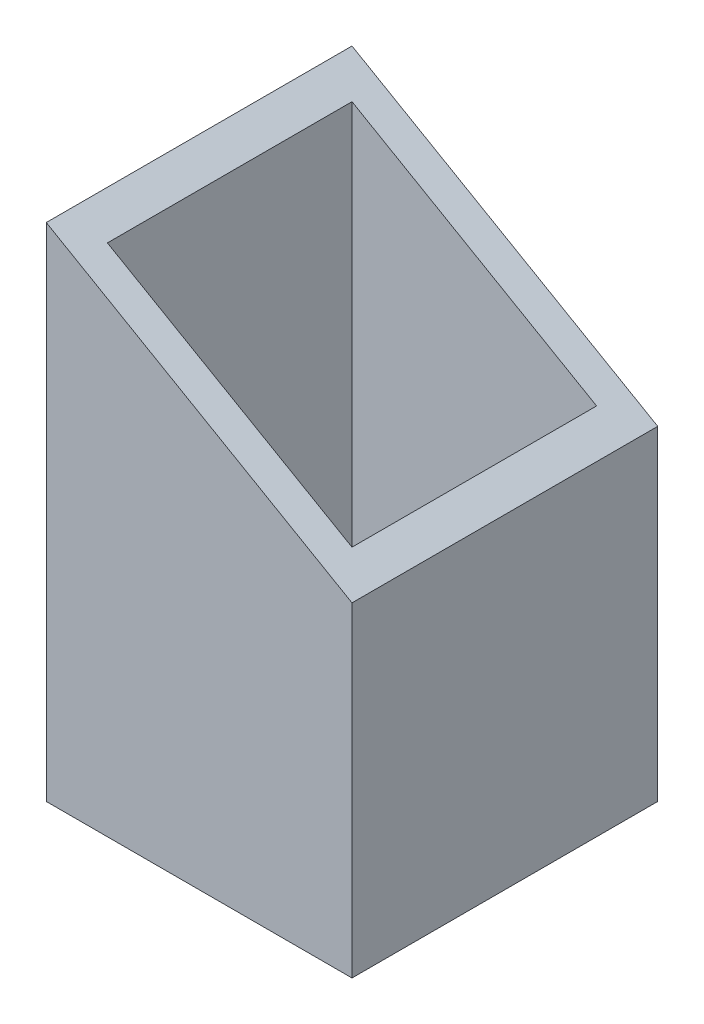
ISO-10303-21;
HEADER;
FILE_DESCRIPTION(('STEP AP214'),'2;1');
FILE_NAME('part.step','',(''),(''),'','','');
FILE_SCHEMA(('AUTOMOTIVE_DESIGN { 1 0 10303 214 1 1 1 1 }'));
ENDSEC;
DATA;
#1=APPLICATION_CONTEXT('core data for automotive mechanical design processes');
#2=APPLICATION_PROTOCOL_DEFINITION('international standard','automotive_design',2000,#1);
#3=PRODUCT_CONTEXT('',#1,'mechanical');
#4=PRODUCT('Part','Part','',(#3));
#5=PRODUCT_RELATED_PRODUCT_CATEGORY('part','',(#4));
#6=PRODUCT_DEFINITION_FORMATION('','',#4);
#7=PRODUCT_DEFINITION_CONTEXT('part definition',#1,'design');
#8=PRODUCT_DEFINITION('design','',#6,#7);
#9=PRODUCT_DEFINITION_SHAPE('','',#8);
#10=(LENGTH_UNIT() NAMED_UNIT(*) SI_UNIT(.MILLI.,.METRE.));
#11=(NAMED_UNIT(*) PLANE_ANGLE_UNIT() SI_UNIT($,.RADIAN.));
#12=(NAMED_UNIT(*) SI_UNIT($,.STERADIAN.) SOLID_ANGLE_UNIT());
#13=UNCERTAINTY_MEASURE_WITH_UNIT(LENGTH_MEASURE(1.E-05),#10,'distance_accuracy_value','');
#14=(GEOMETRIC_REPRESENTATION_CONTEXT(3) GLOBAL_UNCERTAINTY_ASSIGNED_CONTEXT((#13)) GLOBAL_UNIT_ASSIGNED_CONTEXT((#10,
#11,#12)) REPRESENTATION_CONTEXT('',''));
#15=CARTESIAN_POINT('',(0.,0.,0.));
#16=DIRECTION('',(0.,0.,1.));
#17=DIRECTION('',(1.,0.,0.));
#18=AXIS2_PLACEMENT_3D('',#15,#16,#17);
#19=CARTESIAN_POINT('',(-223.415724970984,500000.000000032,1808.3229528099));
#20=DIRECTION('',(1.,0.,0.));
#21=DIRECTION('',(0.,0.,-1.));
#22=AXIS2_PLACEMENT_3D('',#19,#20,#21);
#23=PLANE('',#22);
#24=DIRECTION('',(0.,1.,0.));
#25=VECTOR('',#24,1.);
#26=CARTESIAN_POINT('',(-223.415724971009,500000.000000032,1828.8));
#27=LINE('',#26,#25);
#28=CARTESIAN_POINT('',(-223.415724971003,95.250000000016,1828.8));
#29=VERTEX_POINT('',#28);
#30=CARTESIAN_POINT('',(-223.415724971045,128.989128953536,1828.8));
#31=VERTEX_POINT('',#30);
#32=EDGE_CURVE('E146',#29,#31,#27,.T.);
#33=ORIENTED_EDGE('',*,*,#32,.F.);
#34=DIRECTION('',(0.,0.,1.));
#35=VECTOR('',#34,1.);
#36=CARTESIAN_POINT('',(-223.415724971009,95.25,-500000.000000032));
#37=LINE('',#36,#35);
#38=CARTESIAN_POINT('',(-223.415724971003,95.250000000016,1797.05));
#39=VERTEX_POINT('',#38);
#40=EDGE_CURVE('E137',#29,#39,#37,.F.);
#41=ORIENTED_EDGE('',*,*,#40,.T.);
#42=DIRECTION('',(0.,1.,0.));
#43=VECTOR('',#42,1.);
#44=CARTESIAN_POINT('',(-223.415724971009,500000.000000032,1797.05));
#45=LINE('',#44,#43);
#46=CARTESIAN_POINT('',(-223.415724971048,128.989128953559,1797.05));
#47=VERTEX_POINT('',#46);
#48=EDGE_CURVE('E110',#39,#47,#45,.T.);
#49=ORIENTED_EDGE('',*,*,#48,.T.);
#50=DIRECTION('',(0.,0.,1.));
#51=VECTOR('',#50,1.);
#52=CARTESIAN_POINT('',(-223.415724971231,128.989128953334,1828.8));
#53=LINE('',#52,#51);
#54=EDGE_CURVE('E107',#31,#47,#53,.F.);
#55=ORIENTED_EDGE('',*,*,#54,.F.);
#56=EDGE_LOOP('',(#33,#41,#49,#55));
#57=FACE_BOUND('',#56,.T.);
#58=ADVANCED_FACE('F17',(#57),#23,.T.);
#59=CARTESIAN_POINT('',(-241.414785422981,500000.000000032,1800.225));
#60=DIRECTION('',(0.,0.,1.));
#61=DIRECTION('',(1.,0.,0.));
#62=AXIS2_PLACEMENT_3D('',#59,#60,#61);
#63=PLANE('',#62);
#64=DIRECTION('',(0.,1.,0.));
#65=VECTOR('',#64,1.);
#66=CARTESIAN_POINT('',(-251.990724970984,500000.000000032,1800.225));
#67=LINE('',#66,#65);
#68=CARTESIAN_POINT('',(-251.990724971041,95.250000000016,1800.225));
#69=VERTEX_POINT('',#68);
#70=CARTESIAN_POINT('',(-251.990724971096,145.486912895636,1800.225));
#71=VERTEX_POINT('',#70);
#72=EDGE_CURVE('E115',#69,#71,#67,.T.);
#73=ORIENTED_EDGE('',*,*,#72,.F.);
#74=DIRECTION('',(1.,0.,0.));
#75=VECTOR('',#74,1.);
#76=CARTESIAN_POINT('',(-226.369179823143,95.25,1800.22500000001));
#77=LINE('',#76,#75);
#78=CARTESIAN_POINT('',(-226.590724971003,95.250000000016,1800.225));
#79=VERTEX_POINT('',#78);
#80=EDGE_CURVE('E94',#69,#79,#77,.T.);
#81=ORIENTED_EDGE('',*,*,#80,.T.);
#82=DIRECTION('',(0.,1.,0.));
#83=VECTOR('',#82,1.);
#84=CARTESIAN_POINT('',(-226.590724970984,500000.000000032,1800.225));
#85=LINE('',#84,#83);
#86=CARTESIAN_POINT('',(-226.590724971048,130.822216058151,1800.225));
#87=VERTEX_POINT('',#86);
#88=EDGE_CURVE('E20',#79,#87,#85,.T.);
#89=ORIENTED_EDGE('',*,*,#88,.T.);
#90=DIRECTION('',(-0.866025403784429,0.500000000000017,0.));
#91=VECTOR('',#90,1.);
#92=CARTESIAN_POINT('',(-127.58286248553,73.66,1800.225));
#93=LINE('',#92,#91);
#94=EDGE_CURVE('E79',#71,#87,#93,.F.);
#95=ORIENTED_EDGE('',*,*,#94,.F.);
#96=EDGE_LOOP('',(#73,#81,#89,#95));
#97=FACE_BOUND('',#96,.T.);
#98=ADVANCED_FACE('F93',(#97),#63,.T.);
#99=CARTESIAN_POINT('',(-226.590724970984,500000.000000032,1808.3229528099));
#100=DIRECTION('',(1.,0.,0.));
#101=DIRECTION('',(0.,0.,-1.));
#102=AXIS2_PLACEMENT_3D('',#99,#100,#101);
#103=PLANE('',#102);
#104=DIRECTION('',(0.,1.,0.));
#105=VECTOR('',#104,1.);
#106=CARTESIAN_POINT('',(-226.590724971009,500000.000000032,1825.625));
#107=LINE('',#106,#105);
#108=CARTESIAN_POINT('',(-226.590724970996,95.250000000016,1825.625));
#109=VERTEX_POINT('',#108);
#110=CARTESIAN_POINT('',(-226.590724971049,130.822216058182,1825.625));
#111=VERTEX_POINT('',#110);
#112=EDGE_CURVE('E98',#109,#111,#107,.T.);
#113=ORIENTED_EDGE('',*,*,#112,.T.);
#114=DIRECTION('',(0.,0.,1.));
#115=VECTOR('',#114,1.);
#116=CARTESIAN_POINT('',(-226.590724971245,130.82221605802,1828.8));
#117=LINE('',#116,#115);
#118=EDGE_CURVE('E84',#87,#111,#117,.T.);
#119=ORIENTED_EDGE('',*,*,#118,.F.);
#120=ORIENTED_EDGE('',*,*,#88,.F.);
#121=DIRECTION('',(0.,0.,1.));
#122=VECTOR('',#121,1.);
#123=CARTESIAN_POINT('',(-226.590724971009,95.25,-500000.000000032));
#124=LINE('',#123,#122);
#125=EDGE_CURVE('E131',#79,#109,#124,.T.);
#126=ORIENTED_EDGE('',*,*,#125,.T.);
#127=EDGE_LOOP('',(#113,#119,#120,#126));
#128=FACE_BOUND('',#127,.T.);
#129=ADVANCED_FACE('F99',(#128),#103,.F.);
#130=CARTESIAN_POINT('',(-237.348847091146,500000.000000032,1825.625));
#131=DIRECTION('',(0.,0.,1.));
#132=DIRECTION('',(1.,0.,0.));
#133=AXIS2_PLACEMENT_3D('',#130,#131,#132);
#134=PLANE('',#133);
#135=DIRECTION('',(0.,1.,0.));
#136=VECTOR('',#135,1.);
#137=CARTESIAN_POINT('',(-251.990724970984,500000.000000032,1825.625));
#138=LINE('',#137,#136);
#139=CARTESIAN_POINT('',(-251.990724971096,145.486912895636,1825.625));
#140=VERTEX_POINT('',#139);
#141=CARTESIAN_POINT('',(-251.990724971041,95.250000000016,1825.625));
#142=VERTEX_POINT('',#141);
#143=EDGE_CURVE('E113',#140,#142,#138,.F.);
#144=ORIENTED_EDGE('',*,*,#143,.F.);
#145=DIRECTION('',(-0.866025403784429,0.500000000000017,0.));
#146=VECTOR('',#145,1.);
#147=CARTESIAN_POINT('',(-127.58286248553,73.66,1825.625));
#148=LINE('',#147,#146);
#149=EDGE_CURVE('E101',#111,#140,#148,.T.);
#150=ORIENTED_EDGE('',*,*,#149,.F.);
#151=ORIENTED_EDGE('',*,*,#112,.F.);
#152=DIRECTION('',(1.,0.,0.));
#153=VECTOR('',#152,1.);
#154=CARTESIAN_POINT('',(-226.369179823143,95.25,1825.625));
#155=LINE('',#154,#153);
#156=EDGE_CURVE('E126',#109,#142,#155,.F.);
#157=ORIENTED_EDGE('',*,*,#156,.T.);
#158=EDGE_LOOP('',(#144,#150,#151,#157));
#159=FACE_BOUND('',#158,.T.);
#160=ADVANCED_FACE('F172',(#159),#134,.F.);
#161=CARTESIAN_POINT('',(-251.990724970984,500000.000000032,1808.3229528099));
#162=DIRECTION('',(1.,0.,0.));
#163=DIRECTION('',(0.,0.,-1.));
#164=AXIS2_PLACEMENT_3D('',#161,#162,#163);
#165=PLANE('',#164);
#166=ORIENTED_EDGE('',*,*,#143,.T.);
#167=DIRECTION('',(0.,0.,1.));
#168=VECTOR('',#167,1.);
#169=CARTESIAN_POINT('',(-251.990724971009,95.25,-500000.000000032));
#170=LINE('',#169,#168);
#171=EDGE_CURVE('E120',#142,#69,#170,.F.);
#172=ORIENTED_EDGE('',*,*,#171,.T.);
#173=ORIENTED_EDGE('',*,*,#72,.T.);
#174=DIRECTION('',(0.,0.,1.));
#175=VECTOR('',#174,1.);
#176=CARTESIAN_POINT('',(-251.990724971238,145.486912895433,1828.8));
#177=LINE('',#176,#175);
#178=EDGE_CURVE('E87',#140,#71,#177,.F.);
#179=ORIENTED_EDGE('',*,*,#178,.F.);
#180=EDGE_LOOP('',(#166,#172,#173,#179));
#181=FACE_BOUND('',#180,.T.);
#182=ADVANCED_FACE('F118',(#181),#165,.T.);
#183=CARTESIAN_POINT('',(-241.414785422981,500000.000000032,1797.05));
#184=DIRECTION('',(0.,0.,1.));
#185=DIRECTION('',(1.,0.,0.));
#186=AXIS2_PLACEMENT_3D('',#183,#184,#185);
#187=PLANE('',#186);
#188=DIRECTION('',(-0.866025403784429,0.500000000000017,0.));
#189=VECTOR('',#188,1.);
#190=CARTESIAN_POINT('',(-127.58286248553,73.66,1797.05));
#191=LINE('',#190,#189);
#192=CARTESIAN_POINT('',(-255.1657249711,147.320000000308,1797.05));
#193=VERTEX_POINT('',#192);
#194=EDGE_CURVE('E90',#47,#193,#191,.T.);
#195=ORIENTED_EDGE('',*,*,#194,.F.);
#196=ORIENTED_EDGE('',*,*,#48,.F.);
#197=DIRECTION('',(1.,0.,0.));
#198=VECTOR('',#197,1.);
#199=CARTESIAN_POINT('',(-226.369179823143,95.25,1797.05000000001));
#200=LINE('',#199,#198);
#201=CARTESIAN_POINT('',(-255.16572497106,95.250000000016,1797.05));
#202=VERTEX_POINT('',#201);
#203=EDGE_CURVE('E141',#39,#202,#200,.F.);
#204=ORIENTED_EDGE('',*,*,#203,.T.);
#205=DIRECTION('',(0.,1.,0.));
#206=VECTOR('',#205,1.);
#207=CARTESIAN_POINT('',(-255.16572497106,500000.000000032,1797.05));
#208=LINE('',#207,#206);
#209=EDGE_CURVE('E125',#202,#193,#208,.T.);
#210=ORIENTED_EDGE('',*,*,#209,.T.);
#211=EDGE_LOOP('',(#195,#196,#204,#210));
#212=FACE_BOUND('',#211,.T.);
#213=ADVANCED_FACE('F163',(#212),#187,.F.);
#214=CARTESIAN_POINT('',(-127.58286248553,73.66,1828.8));
#215=DIRECTION('',(0.500000000000017,0.866025403784429,0.));
#216=DIRECTION('',(-0.866025403784429,0.500000000000017,0.));
#217=AXIS2_PLACEMENT_3D('',#214,#215,#216);
#218=PLANE('',#217);
#219=ORIENTED_EDGE('',*,*,#149,.T.);
#220=ORIENTED_EDGE('',*,*,#178,.T.);
#221=ORIENTED_EDGE('',*,*,#94,.T.);
#222=ORIENTED_EDGE('',*,*,#118,.T.);
#223=EDGE_LOOP('',(#219,#220,#221,#222));
#224=FACE_BOUND('',#223,.T.);
#225=DIRECTION('',(0.,0.,-1.));
#226=VECTOR('',#225,1.);
#227=CARTESIAN_POINT('',(-255.16572497106,147.320000000377,1808.3229528099));
#228=LINE('',#227,#226);
#229=CARTESIAN_POINT('',(-255.165724971137,147.320000000222,1828.8));
#230=VERTEX_POINT('',#229);
#231=EDGE_CURVE('E129',#193,#230,#228,.F.);
#232=ORIENTED_EDGE('',*,*,#231,.T.);
#233=DIRECTION('',(-0.866025403784928,0.499999999999152,0.));
#234=VECTOR('',#233,1.);
#235=CARTESIAN_POINT('',(-223.415724971085,128.989128953606,1828.8));
#236=LINE('',#235,#234);
#237=EDGE_CURVE('E144',#31,#230,#236,.T.);
#238=ORIENTED_EDGE('',*,*,#237,.F.);
#239=ORIENTED_EDGE('',*,*,#54,.T.);
#240=ORIENTED_EDGE('',*,*,#194,.T.);
#241=EDGE_LOOP('',(#232,#238,#239,#240));
#242=FACE_BOUND('',#241,.T.);
#243=ADVANCED_FACE('F81',(#224,#242),#218,.T.);
#244=CARTESIAN_POINT('',(-237.348847091146,500000.000000032,1828.8));
#245=DIRECTION('',(0.,0.,1.));
#246=DIRECTION('',(1.,0.,0.));
#247=AXIS2_PLACEMENT_3D('',#244,#245,#246);
#248=PLANE('',#247);
#249=DIRECTION('',(0.,1.,0.));
#250=VECTOR('',#249,1.);
#251=CARTESIAN_POINT('',(-255.16572497106,500000.000000032,1828.8));
#252=LINE('',#251,#250);
#253=CARTESIAN_POINT('',(-255.16572497106,95.250000000016,1828.8));
#254=VERTEX_POINT('',#253);
#255=EDGE_CURVE('E26',#230,#254,#252,.F.);
#256=ORIENTED_EDGE('',*,*,#255,.T.);
#257=DIRECTION('',(1.,0.,0.));
#258=VECTOR('',#257,1.);
#259=CARTESIAN_POINT('',(-226.369179823143,95.25,1828.8));
#260=LINE('',#259,#258);
#261=EDGE_CURVE('E34',#254,#29,#260,.T.);
#262=ORIENTED_EDGE('',*,*,#261,.T.);
#263=ORIENTED_EDGE('',*,*,#32,.T.);
#264=ORIENTED_EDGE('',*,*,#237,.T.);
#265=EDGE_LOOP('',(#256,#262,#263,#264));
#266=FACE_BOUND('',#265,.T.);
#267=ADVANCED_FACE('F150',(#266),#248,.T.);
#268=CARTESIAN_POINT('',(-226.369179823143,95.25,-500000.000000032));
#269=DIRECTION('',(0.,1.,0.));
#270=DIRECTION('',(0.,0.,1.));
#271=AXIS2_PLACEMENT_3D('',#268,#269,#270);
#272=PLANE('',#271);
#273=ORIENTED_EDGE('',*,*,#156,.F.);
#274=ORIENTED_EDGE('',*,*,#125,.F.);
#275=ORIENTED_EDGE('',*,*,#80,.F.);
#276=ORIENTED_EDGE('',*,*,#171,.F.);
#277=EDGE_LOOP('',(#273,#274,#275,#276));
#278=FACE_BOUND('',#277,.T.);
#279=ORIENTED_EDGE('',*,*,#261,.F.);
#280=DIRECTION('',(0.,0.,-1.));
#281=VECTOR('',#280,1.);
#282=CARTESIAN_POINT('',(-255.16572497106,95.2500000000214,1808.3229528099));
#283=LINE('',#282,#281);
#284=EDGE_CURVE('E11',#254,#202,#283,.T.);
#285=ORIENTED_EDGE('',*,*,#284,.T.);
#286=ORIENTED_EDGE('',*,*,#203,.F.);
#287=ORIENTED_EDGE('',*,*,#40,.F.);
#288=EDGE_LOOP('',(#279,#285,#286,#287));
#289=FACE_BOUND('',#288,.T.);
#290=ADVANCED_FACE('F161',(#278,#289),#272,.F.);
#291=CARTESIAN_POINT('',(-255.16572497106,500000.000000032,1808.3229528099));
#292=DIRECTION('',(1.,0.,0.));
#293=DIRECTION('',(0.,0.,-1.));
#294=AXIS2_PLACEMENT_3D('',#291,#292,#293);
#295=PLANE('',#294);
#296=ORIENTED_EDGE('',*,*,#255,.F.);
#297=ORIENTED_EDGE('',*,*,#231,.F.);
#298=ORIENTED_EDGE('',*,*,#209,.F.);
#299=ORIENTED_EDGE('',*,*,#284,.F.);
#300=EDGE_LOOP('',(#296,#297,#298,#299));
#301=FACE_BOUND('',#300,.T.);
#302=ADVANCED_FACE('F159',(#301),#295,.F.);
#303=CLOSED_SHELL('',(#58,#98,#129,#160,#182,#213,#243,#267,#290,#302));
#304=MANIFOLD_SOLID_BREP('B1',#303);
#305=ADVANCED_BREP_SHAPE_REPRESENTATION('',(#18,#304),#14);
#306=SHAPE_DEFINITION_REPRESENTATION(#9,#305);
ENDSEC;
END-ISO-10303-21;
